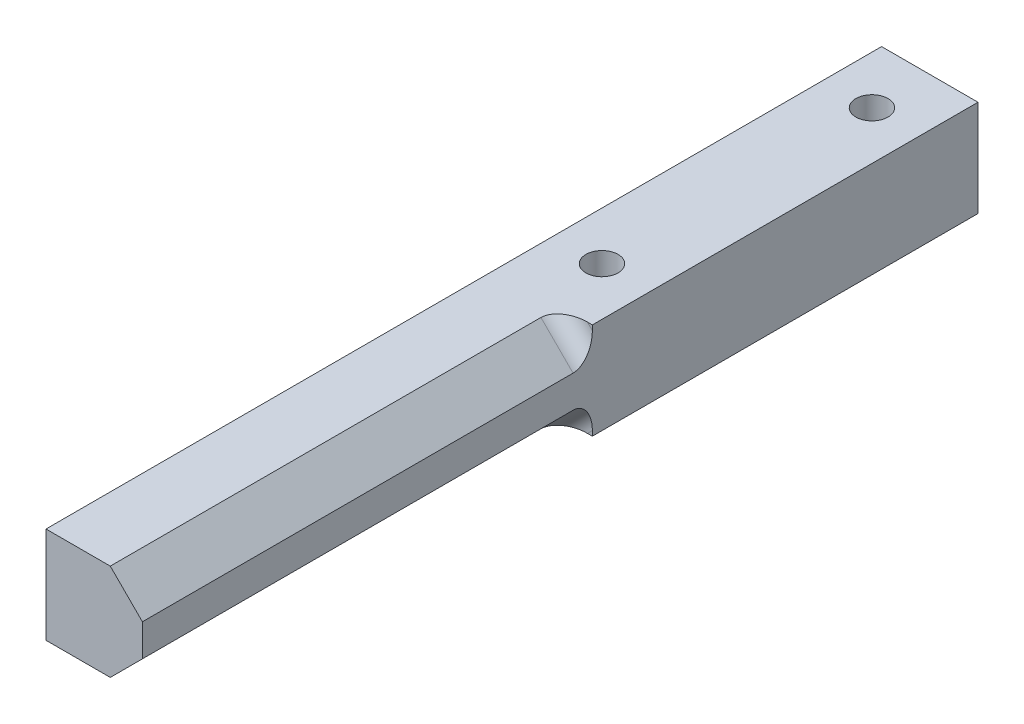
ISO-10303-21;
HEADER;
FILE_DESCRIPTION(('STEP AP214'),'2;1');
FILE_NAME('part.step','',(''),(''),'','','');
FILE_SCHEMA(('AUTOMOTIVE_DESIGN { 1 0 10303 214 1 1 1 1 }'));
ENDSEC;
DATA;
#1=APPLICATION_CONTEXT('core data for automotive mechanical design processes');
#2=APPLICATION_PROTOCOL_DEFINITION('international standard','automotive_design',2000,#1);
#3=PRODUCT_CONTEXT('',#1,'mechanical');
#4=PRODUCT('Part','Part','',(#3));
#5=PRODUCT_RELATED_PRODUCT_CATEGORY('part','',(#4));
#6=PRODUCT_DEFINITION_FORMATION('','',#4);
#7=PRODUCT_DEFINITION_CONTEXT('part definition',#1,'design');
#8=PRODUCT_DEFINITION('design','',#6,#7);
#9=PRODUCT_DEFINITION_SHAPE('','',#8);
#10=(LENGTH_UNIT() NAMED_UNIT(*) SI_UNIT(.MILLI.,.METRE.));
#11=(NAMED_UNIT(*) PLANE_ANGLE_UNIT() SI_UNIT($,.RADIAN.));
#12=(NAMED_UNIT(*) SI_UNIT($,.STERADIAN.) SOLID_ANGLE_UNIT());
#13=UNCERTAINTY_MEASURE_WITH_UNIT(LENGTH_MEASURE(1.E-05),#10,'distance_accuracy_value','');
#14=(GEOMETRIC_REPRESENTATION_CONTEXT(3) GLOBAL_UNCERTAINTY_ASSIGNED_CONTEXT((#13)) GLOBAL_UNIT_ASSIGNED_CONTEXT((#10,
#11,#12)) REPRESENTATION_CONTEXT('',''));
#15=CARTESIAN_POINT('',(0.,0.,0.));
#16=DIRECTION('',(0.,0.,1.));
#17=DIRECTION('',(1.,0.,0.));
#18=AXIS2_PLACEMENT_3D('',#15,#16,#17);
#19=CARTESIAN_POINT('',(3.75,-3.75,65.));
#20=DIRECTION('',(-1.,0.,0.));
#21=DIRECTION('',(0.,0.,1.));
#22=AXIS2_PLACEMENT_3D('',#19,#20,#21);
#23=PLANE('',#22);
#24=DIRECTION('',(0.,1.,0.));
#25=VECTOR('',#24,1.);
#26=CARTESIAN_POINT('',(3.75,-3.75,65.));
#27=LINE('',#26,#25);
#28=CARTESIAN_POINT('',(3.75,-1.25,65.));
#29=VERTEX_POINT('',#28);
#30=CARTESIAN_POINT('',(3.75,1.25,65.));
#31=VERTEX_POINT('',#30);
#32=EDGE_CURVE('E154',#29,#31,#27,.T.);
#33=ORIENTED_EDGE('',*,*,#32,.F.);
#34=DIRECTION('',(0.,0.,-1.));
#35=VECTOR('',#34,1.);
#36=CARTESIAN_POINT('',(3.75,-1.25,65.));
#37=LINE('',#36,#35);
#38=CARTESIAN_POINT('',(3.75,-1.25,31.5));
#39=VERTEX_POINT('',#38);
#40=EDGE_CURVE('E116',#29,#39,#37,.T.);
#41=ORIENTED_EDGE('',*,*,#40,.T.);
#42=CARTESIAN_POINT('',(3.75,-3.37132034355964,31.5));
#43=DIRECTION('',(-1.,0.,0.));
#44=DIRECTION('',(0.,-1.,0.));
#45=AXIS2_PLACEMENT_3D('',#42,#43,#44);
#46=ELLIPSE('',#45,2.12132034355964,1.5);
#47=CARTESIAN_POINT('',(3.75,-3.37132034355964,30.));
#48=VERTEX_POINT('',#47);
#49=EDGE_CURVE('E170',#39,#48,#46,.T.);
#50=ORIENTED_EDGE('',*,*,#49,.T.);
#51=DIRECTION('',(0.,-1.,0.));
#52=VECTOR('',#51,1.);
#53=CARTESIAN_POINT('',(3.75,-1.25,30.));
#54=LINE('',#53,#52);
#55=CARTESIAN_POINT('',(3.75,-3.75,30.));
#56=VERTEX_POINT('',#55);
#57=EDGE_CURVE('E174',#48,#56,#54,.T.);
#58=ORIENTED_EDGE('',*,*,#57,.T.);
#59=DIRECTION('',(0.,0.,-1.));
#60=VECTOR('',#59,1.);
#61=CARTESIAN_POINT('',(3.75,-3.75,65.));
#62=LINE('',#61,#60);
#63=CARTESIAN_POINT('',(3.75,-3.75,0.));
#64=VERTEX_POINT('',#63);
#65=EDGE_CURVE('E136',#56,#64,#62,.T.);
#66=ORIENTED_EDGE('',*,*,#65,.T.);
#67=DIRECTION('',(0.,1.,0.));
#68=VECTOR('',#67,1.);
#69=CARTESIAN_POINT('',(3.75,-3.75,0.));
#70=LINE('',#69,#68);
#71=CARTESIAN_POINT('',(3.75,3.75,0.));
#72=VERTEX_POINT('',#71);
#73=EDGE_CURVE('E144',#64,#72,#70,.T.);
#74=ORIENTED_EDGE('',*,*,#73,.T.);
#75=DIRECTION('',(0.,0.,-1.));
#76=VECTOR('',#75,1.);
#77=CARTESIAN_POINT('',(3.75,3.75,65.));
#78=LINE('',#77,#76);
#79=CARTESIAN_POINT('',(3.75,3.75,30.));
#80=VERTEX_POINT('',#79);
#81=EDGE_CURVE('E160',#80,#72,#78,.T.);
#82=ORIENTED_EDGE('',*,*,#81,.F.);
#83=DIRECTION('',(0.,-1.,0.));
#84=VECTOR('',#83,1.);
#85=CARTESIAN_POINT('',(3.75,3.75,30.));
#86=LINE('',#85,#84);
#87=CARTESIAN_POINT('',(3.75,3.37132034355964,30.));
#88=VERTEX_POINT('',#87);
#89=EDGE_CURVE('E308',#80,#88,#86,.T.);
#90=ORIENTED_EDGE('',*,*,#89,.T.);
#91=CARTESIAN_POINT('',(3.75,3.37132034355964,31.5));
#92=DIRECTION('',(-1.,0.,0.));
#93=DIRECTION('',(0.,-1.,0.));
#94=AXIS2_PLACEMENT_3D('',#91,#92,#93);
#95=ELLIPSE('',#94,2.12132034355964,1.5);
#96=CARTESIAN_POINT('',(3.75,1.25,31.5));
#97=VERTEX_POINT('',#96);
#98=EDGE_CURVE('E11',#88,#97,#95,.T.);
#99=ORIENTED_EDGE('',*,*,#98,.T.);
#100=DIRECTION('',(0.,0.,-1.));
#101=VECTOR('',#100,1.);
#102=CARTESIAN_POINT('',(3.75,1.25,65.));
#103=LINE('',#102,#101);
#104=EDGE_CURVE('E315',#31,#97,#103,.T.);
#105=ORIENTED_EDGE('',*,*,#104,.F.);
#106=EDGE_LOOP('',(#33,#41,#50,#58,#66,#74,#82,#90,#99,#105));
#107=FACE_BOUND('',#106,.T.);
#108=ADVANCED_FACE('F33',(#107),#23,.F.);
#109=CARTESIAN_POINT('',(-3.75,3.75,65.));
#110=DIRECTION('',(0.,-1.,0.));
#111=DIRECTION('',(0.,0.,-1.));
#112=AXIS2_PLACEMENT_3D('',#109,#110,#111);
#113=PLANE('',#112);
#114=CARTESIAN_POINT('',(0.,3.75,25.5));
#115=DIRECTION('',(0.,1.,0.));
#116=DIRECTION('',(0.,0.,1.));
#117=AXIS2_PLACEMENT_3D('',#114,#115,#116);
#118=CIRCLE('',#117,1.25);
#119=CARTESIAN_POINT('',(0.,3.75,26.75));
#120=VERTEX_POINT('',#119);
#121=EDGE_CURVE('E319',#120,#120,#118,.T.);
#122=ORIENTED_EDGE('',*,*,#121,.F.);
#123=EDGE_LOOP('',(#122));
#124=FACE_BOUND('',#123,.T.);
#125=CARTESIAN_POINT('',(0.,3.75,4.5));
#126=DIRECTION('',(0.,1.,0.));
#127=DIRECTION('',(0.,0.,1.));
#128=AXIS2_PLACEMENT_3D('',#125,#126,#127);
#129=CIRCLE('',#128,1.25);
#130=CARTESIAN_POINT('',(0.,3.75,5.75));
#131=VERTEX_POINT('',#130);
#132=EDGE_CURVE('E329',#131,#131,#129,.T.);
#133=ORIENTED_EDGE('',*,*,#132,.F.);
#134=EDGE_LOOP('',(#133));
#135=FACE_BOUND('',#134,.T.);
#136=DIRECTION('',(-1.,0.,0.));
#137=VECTOR('',#136,1.);
#138=CARTESIAN_POINT('',(-3.75,3.75,65.));
#139=LINE('',#138,#137);
#140=CARTESIAN_POINT('',(1.25,3.75,65.));
#141=VERTEX_POINT('',#140);
#142=CARTESIAN_POINT('',(-3.75,3.75,65.));
#143=VERTEX_POINT('',#142);
#144=EDGE_CURVE('E140',#141,#143,#139,.T.);
#145=ORIENTED_EDGE('',*,*,#144,.F.);
#146=DIRECTION('',(0.,0.,-1.));
#147=VECTOR('',#146,1.);
#148=CARTESIAN_POINT('',(1.25,3.75,65.));
#149=LINE('',#148,#147);
#150=CARTESIAN_POINT('',(1.25,3.75,31.5));
#151=VERTEX_POINT('',#150);
#152=EDGE_CURVE('E320',#141,#151,#149,.T.);
#153=ORIENTED_EDGE('',*,*,#152,.T.);
#154=CARTESIAN_POINT('',(3.37132034355965,3.75,31.5));
#155=DIRECTION('',(0.,-1.,0.));
#156=DIRECTION('',(1.,0.,0.));
#157=AXIS2_PLACEMENT_3D('',#154,#155,#156);
#158=ELLIPSE('',#157,2.12132034355964,1.5);
#159=CARTESIAN_POINT('',(3.37132034355965,3.75,30.));
#160=VERTEX_POINT('',#159);
#161=EDGE_CURVE('E41',#151,#160,#158,.T.);
#162=ORIENTED_EDGE('',*,*,#161,.T.);
#163=DIRECTION('',(1.,0.,0.));
#164=VECTOR('',#163,1.);
#165=CARTESIAN_POINT('',(1.25,3.75,30.));
#166=LINE('',#165,#164);
#167=EDGE_CURVE('E130',#160,#80,#166,.T.);
#168=ORIENTED_EDGE('',*,*,#167,.T.);
#169=ORIENTED_EDGE('',*,*,#81,.T.);
#170=DIRECTION('',(-1.,0.,0.));
#171=VECTOR('',#170,1.);
#172=CARTESIAN_POINT('',(-3.75,3.75,0.));
#173=LINE('',#172,#171);
#174=CARTESIAN_POINT('',(-3.75,3.75,0.));
#175=VERTEX_POINT('',#174);
#176=EDGE_CURVE('E147',#72,#175,#173,.T.);
#177=ORIENTED_EDGE('',*,*,#176,.T.);
#178=DIRECTION('',(0.,0.,-1.));
#179=VECTOR('',#178,1.);
#180=CARTESIAN_POINT('',(-3.75,3.75,65.));
#181=LINE('',#180,#179);
#182=EDGE_CURVE('E157',#143,#175,#181,.T.);
#183=ORIENTED_EDGE('',*,*,#182,.F.);
#184=EDGE_LOOP('',(#145,#153,#162,#168,#169,#177,#183));
#185=FACE_BOUND('',#184,.T.);
#186=ADVANCED_FACE('F192',(#124,#135,#185),#113,.F.);
#187=CARTESIAN_POINT('',(-3.75,-3.75,65.));
#188=DIRECTION('',(1.,0.,0.));
#189=DIRECTION('',(0.,0.,-1.));
#190=AXIS2_PLACEMENT_3D('',#187,#188,#189);
#191=PLANE('',#190);
#192=DIRECTION('',(0.,-1.,0.));
#193=VECTOR('',#192,1.);
#194=CARTESIAN_POINT('',(-3.75,-3.75,0.));
#195=LINE('',#194,#193);
#196=CARTESIAN_POINT('',(-3.75,-3.75,0.));
#197=VERTEX_POINT('',#196);
#198=EDGE_CURVE('E150',#175,#197,#195,.T.);
#199=ORIENTED_EDGE('',*,*,#198,.T.);
#200=DIRECTION('',(0.,0.,-1.));
#201=VECTOR('',#200,1.);
#202=CARTESIAN_POINT('',(-3.75,-3.75,65.));
#203=LINE('',#202,#201);
#204=CARTESIAN_POINT('',(-3.75,-3.75,65.));
#205=VERTEX_POINT('',#204);
#206=EDGE_CURVE('E138',#205,#197,#203,.T.);
#207=ORIENTED_EDGE('',*,*,#206,.F.);
#208=DIRECTION('',(0.,-1.,0.));
#209=VECTOR('',#208,1.);
#210=CARTESIAN_POINT('',(-3.75,-3.75,65.));
#211=LINE('',#210,#209);
#212=EDGE_CURVE('E134',#143,#205,#211,.T.);
#213=ORIENTED_EDGE('',*,*,#212,.F.);
#214=ORIENTED_EDGE('',*,*,#182,.T.);
#215=EDGE_LOOP('',(#199,#207,#213,#214));
#216=FACE_BOUND('',#215,.T.);
#217=ADVANCED_FACE('F196',(#216),#191,.F.);
#218=CARTESIAN_POINT('',(-3.75,-3.75,65.));
#219=DIRECTION('',(0.,1.,0.));
#220=DIRECTION('',(0.,0.,1.));
#221=AXIS2_PLACEMENT_3D('',#218,#219,#220);
#222=PLANE('',#221);
#223=CARTESIAN_POINT('',(0.,-3.75,25.5));
#224=DIRECTION('',(0.,1.,0.));
#225=DIRECTION('',(0.,0.,1.));
#226=AXIS2_PLACEMENT_3D('',#223,#224,#225);
#227=CIRCLE('',#226,1.25);
#228=CARTESIAN_POINT('',(0.,-3.75,26.75));
#229=VERTEX_POINT('',#228);
#230=EDGE_CURVE('E323',#229,#229,#227,.T.);
#231=ORIENTED_EDGE('',*,*,#230,.T.);
#232=EDGE_LOOP('',(#231));
#233=FACE_BOUND('',#232,.T.);
#234=CARTESIAN_POINT('',(0.,-3.75,4.5));
#235=DIRECTION('',(0.,1.,0.));
#236=DIRECTION('',(0.,0.,1.));
#237=AXIS2_PLACEMENT_3D('',#234,#235,#236);
#238=CIRCLE('',#237,1.25);
#239=CARTESIAN_POINT('',(0.,-3.75,5.75));
#240=VERTEX_POINT('',#239);
#241=EDGE_CURVE('E148',#240,#240,#238,.T.);
#242=ORIENTED_EDGE('',*,*,#241,.T.);
#243=EDGE_LOOP('',(#242));
#244=FACE_BOUND('',#243,.T.);
#245=DIRECTION('',(-1.,0.,0.));
#246=VECTOR('',#245,1.);
#247=CARTESIAN_POINT('',(3.75,-3.75,30.));
#248=LINE('',#247,#246);
#249=CARTESIAN_POINT('',(3.37132034355964,-3.75,30.));
#250=VERTEX_POINT('',#249);
#251=EDGE_CURVE('E120',#56,#250,#248,.T.);
#252=ORIENTED_EDGE('',*,*,#251,.T.);
#253=CARTESIAN_POINT('',(3.37132034355964,-3.75,31.5));
#254=DIRECTION('',(0.,1.,0.));
#255=DIRECTION('',(-1.,0.,0.));
#256=AXIS2_PLACEMENT_3D('',#253,#254,#255);
#257=ELLIPSE('',#256,2.12132034355964,1.5);
#258=CARTESIAN_POINT('',(1.25,-3.75,31.5));
#259=VERTEX_POINT('',#258);
#260=EDGE_CURVE('E129',#250,#259,#257,.T.);
#261=ORIENTED_EDGE('',*,*,#260,.T.);
#262=DIRECTION('',(0.,0.,-1.));
#263=VECTOR('',#262,1.);
#264=CARTESIAN_POINT('',(1.25,-3.75,65.));
#265=LINE('',#264,#263);
#266=CARTESIAN_POINT('',(1.25,-3.75,65.));
#267=VERTEX_POINT('',#266);
#268=EDGE_CURVE('E113',#267,#259,#265,.T.);
#269=ORIENTED_EDGE('',*,*,#268,.F.);
#270=DIRECTION('',(1.,0.,0.));
#271=VECTOR('',#270,1.);
#272=CARTESIAN_POINT('',(-3.75,-3.75,65.));
#273=LINE('',#272,#271);
#274=EDGE_CURVE('E127',#205,#267,#273,.T.);
#275=ORIENTED_EDGE('',*,*,#274,.F.);
#276=ORIENTED_EDGE('',*,*,#206,.T.);
#277=DIRECTION('',(1.,0.,0.));
#278=VECTOR('',#277,1.);
#279=CARTESIAN_POINT('',(-3.75,-3.75,0.));
#280=LINE('',#279,#278);
#281=EDGE_CURVE('E152',#197,#64,#280,.T.);
#282=ORIENTED_EDGE('',*,*,#281,.T.);
#283=ORIENTED_EDGE('',*,*,#65,.F.);
#284=EDGE_LOOP('',(#252,#261,#269,#275,#276,#282,#283));
#285=FACE_BOUND('',#284,.T.);
#286=ADVANCED_FACE('F125',(#233,#244,#285),#222,.F.);
#287=CARTESIAN_POINT('',(0.,0.,65.));
#288=DIRECTION('',(0.,0.,-1.));
#289=DIRECTION('',(-1.,0.,0.));
#290=AXIS2_PLACEMENT_3D('',#287,#288,#289);
#291=PLANE('',#290);
#292=ORIENTED_EDGE('',*,*,#274,.T.);
#293=DIRECTION('',(0.707106781186547,0.707106781186548,0.));
#294=VECTOR('',#293,1.);
#295=CARTESIAN_POINT('',(1.25,-3.75,65.));
#296=LINE('',#295,#294);
#297=EDGE_CURVE('E109',#267,#29,#296,.T.);
#298=ORIENTED_EDGE('',*,*,#297,.T.);
#299=ORIENTED_EDGE('',*,*,#32,.T.);
#300=DIRECTION('',(-0.707106781186548,0.707106781186548,0.));
#301=VECTOR('',#300,1.);
#302=CARTESIAN_POINT('',(3.75,1.25,65.));
#303=LINE('',#302,#301);
#304=EDGE_CURVE('E318',#31,#141,#303,.T.);
#305=ORIENTED_EDGE('',*,*,#304,.T.);
#306=ORIENTED_EDGE('',*,*,#144,.T.);
#307=ORIENTED_EDGE('',*,*,#212,.T.);
#308=EDGE_LOOP('',(#292,#298,#299,#305,#306,#307));
#309=FACE_BOUND('',#308,.T.);
#310=ADVANCED_FACE('F132',(#309),#291,.F.);
#311=CARTESIAN_POINT('',(0.,0.,0.));
#312=DIRECTION('',(0.,0.,-1.));
#313=DIRECTION('',(-1.,0.,0.));
#314=AXIS2_PLACEMENT_3D('',#311,#312,#313);
#315=PLANE('',#314);
#316=ORIENTED_EDGE('',*,*,#73,.F.);
#317=ORIENTED_EDGE('',*,*,#281,.F.);
#318=ORIENTED_EDGE('',*,*,#198,.F.);
#319=ORIENTED_EDGE('',*,*,#176,.F.);
#320=EDGE_LOOP('',(#316,#317,#318,#319));
#321=FACE_BOUND('',#320,.T.);
#322=ADVANCED_FACE('F206',(#321),#315,.T.);
#323=CARTESIAN_POINT('',(0.,-3.75,4.5));
#324=DIRECTION('',(0.,1.,0.));
#325=DIRECTION('',(0.,0.,1.));
#326=AXIS2_PLACEMENT_3D('',#323,#324,#325);
#327=CYLINDRICAL_SURFACE('',#326,1.25);
#328=ORIENTED_EDGE('',*,*,#241,.F.);
#329=EDGE_LOOP('',(#328));
#330=FACE_BOUND('',#329,.T.);
#331=ORIENTED_EDGE('',*,*,#132,.T.);
#332=EDGE_LOOP('',(#331));
#333=FACE_BOUND('',#332,.T.);
#334=ADVANCED_FACE('F209',(#330,#333),#327,.F.);
#335=CARTESIAN_POINT('',(0.,-3.75,25.5));
#336=DIRECTION('',(0.,1.,0.));
#337=DIRECTION('',(0.,0.,1.));
#338=AXIS2_PLACEMENT_3D('',#335,#336,#337);
#339=CYLINDRICAL_SURFACE('',#338,1.25);
#340=ORIENTED_EDGE('',*,*,#230,.F.);
#341=EDGE_LOOP('',(#340));
#342=FACE_BOUND('',#341,.T.);
#343=ORIENTED_EDGE('',*,*,#121,.T.);
#344=EDGE_LOOP('',(#343));
#345=FACE_BOUND('',#344,.T.);
#346=ADVANCED_FACE('F215',(#342,#345),#339,.F.);
#347=CARTESIAN_POINT('',(3.75,1.25,65.));
#348=DIRECTION('',(-0.707106781186548,-0.707106781186548,0.));
#349=DIRECTION('',(0.707106781186548,-0.707106781186548,0.));
#350=AXIS2_PLACEMENT_3D('',#347,#348,#349);
#351=PLANE('',#350);
#352=ORIENTED_EDGE('',*,*,#104,.T.);
#353=DIRECTION('',(-0.707106781186548,0.707106781186548,0.));
#354=VECTOR('',#353,1.);
#355=CARTESIAN_POINT('',(1.25,3.75,31.5));
#356=LINE('',#355,#354);
#357=EDGE_CURVE('E166',#97,#151,#356,.T.);
#358=ORIENTED_EDGE('',*,*,#357,.T.);
#359=ORIENTED_EDGE('',*,*,#152,.F.);
#360=ORIENTED_EDGE('',*,*,#304,.F.);
#361=EDGE_LOOP('',(#352,#358,#359,#360));
#362=FACE_BOUND('',#361,.T.);
#363=ADVANCED_FACE('F219',(#362),#351,.F.);
#364=CARTESIAN_POINT('',(0.,0.,30.));
#365=DIRECTION('',(0.,0.,-1.));
#366=DIRECTION('',(-1.,0.,0.));
#367=AXIS2_PLACEMENT_3D('',#364,#365,#366);
#368=PLANE('',#367);
#369=ORIENTED_EDGE('',*,*,#167,.F.);
#370=DIRECTION('',(-0.707106781186548,0.707106781186548,0.));
#371=VECTOR('',#370,1.);
#372=CARTESIAN_POINT('',(4.81066017177982,2.31066017177982,30.));
#373=LINE('',#372,#371);
#374=EDGE_CURVE('E54',#160,#88,#373,.F.);
#375=ORIENTED_EDGE('',*,*,#374,.T.);
#376=ORIENTED_EDGE('',*,*,#89,.F.);
#377=EDGE_LOOP('',(#369,#375,#376));
#378=FACE_BOUND('',#377,.T.);
#379=ADVANCED_FACE('F223',(#378),#368,.F.);
#380=CARTESIAN_POINT('',(1.25,-3.75,65.));
#381=DIRECTION('',(-0.707106781186548,0.707106781186547,0.));
#382=DIRECTION('',(-0.707106781186547,-0.707106781186548,0.));
#383=AXIS2_PLACEMENT_3D('',#380,#381,#382);
#384=PLANE('',#383);
#385=ORIENTED_EDGE('',*,*,#268,.T.);
#386=DIRECTION('',(0.707106781186547,0.707106781186548,0.));
#387=VECTOR('',#386,1.);
#388=CARTESIAN_POINT('',(3.75,-1.25,31.5));
#389=LINE('',#388,#387);
#390=EDGE_CURVE('E162',#259,#39,#389,.T.);
#391=ORIENTED_EDGE('',*,*,#390,.T.);
#392=ORIENTED_EDGE('',*,*,#40,.F.);
#393=ORIENTED_EDGE('',*,*,#297,.F.);
#394=EDGE_LOOP('',(#385,#391,#392,#393));
#395=FACE_BOUND('',#394,.T.);
#396=ADVANCED_FACE('F111',(#395),#384,.F.);
#397=CARTESIAN_POINT('',(0.,0.,30.));
#398=DIRECTION('',(0.,0.,-1.));
#399=DIRECTION('',(-1.,0.,0.));
#400=AXIS2_PLACEMENT_3D('',#397,#398,#399);
#401=PLANE('',#400);
#402=ORIENTED_EDGE('',*,*,#57,.F.);
#403=DIRECTION('',(0.707106781186547,0.707106781186548,0.));
#404=VECTOR('',#403,1.);
#405=CARTESIAN_POINT('',(2.31066017177982,-4.81066017177982,30.));
#406=LINE('',#405,#404);
#407=EDGE_CURVE('E164',#48,#250,#406,.F.);
#408=ORIENTED_EDGE('',*,*,#407,.T.);
#409=ORIENTED_EDGE('',*,*,#251,.F.);
#410=EDGE_LOOP('',(#402,#408,#409));
#411=FACE_BOUND('',#410,.T.);
#412=ADVANCED_FACE('F179',(#411),#401,.F.);
#413=CARTESIAN_POINT('',(2.31066017177982,-4.81066017177982,31.5));
#414=DIRECTION('',(-0.707106781186547,-0.707106781186548,0.));
#415=DIRECTION('',(0.707106781186548,-0.707106781186547,0.));
#416=AXIS2_PLACEMENT_3D('',#413,#414,#415);
#417=CYLINDRICAL_SURFACE('',#416,1.5);
#418=ORIENTED_EDGE('',*,*,#260,.F.);
#419=ORIENTED_EDGE('',*,*,#407,.F.);
#420=ORIENTED_EDGE('',*,*,#49,.F.);
#421=ORIENTED_EDGE('',*,*,#390,.F.);
#422=EDGE_LOOP('',(#418,#419,#420,#421));
#423=FACE_BOUND('',#422,.T.);
#424=ADVANCED_FACE('F182',(#423),#417,.F.);
#425=CARTESIAN_POINT('',(4.81066017177982,2.31066017177982,31.5));
#426=DIRECTION('',(0.707106781186548,-0.707106781186548,0.));
#427=DIRECTION('',(0.707106781186548,0.707106781186548,0.));
#428=AXIS2_PLACEMENT_3D('',#425,#426,#427);
#429=CYLINDRICAL_SURFACE('',#428,1.5);
#430=ORIENTED_EDGE('',*,*,#98,.F.);
#431=ORIENTED_EDGE('',*,*,#374,.F.);
#432=ORIENTED_EDGE('',*,*,#161,.F.);
#433=ORIENTED_EDGE('',*,*,#357,.F.);
#434=EDGE_LOOP('',(#430,#431,#432,#433));
#435=FACE_BOUND('',#434,.T.);
#436=ADVANCED_FACE('F35',(#435),#429,.F.);
#437=CLOSED_SHELL('',(#108,#186,#217,#286,#310,#322,#334,#346,#363,#379,#396,#412,#424,#436));
#438=MANIFOLD_SOLID_BREP('B2',#437);
#439=ADVANCED_BREP_SHAPE_REPRESENTATION('',(#18,#438),#14);
#440=SHAPE_DEFINITION_REPRESENTATION(#9,#439);
ENDSEC;
END-ISO-10303-21;
